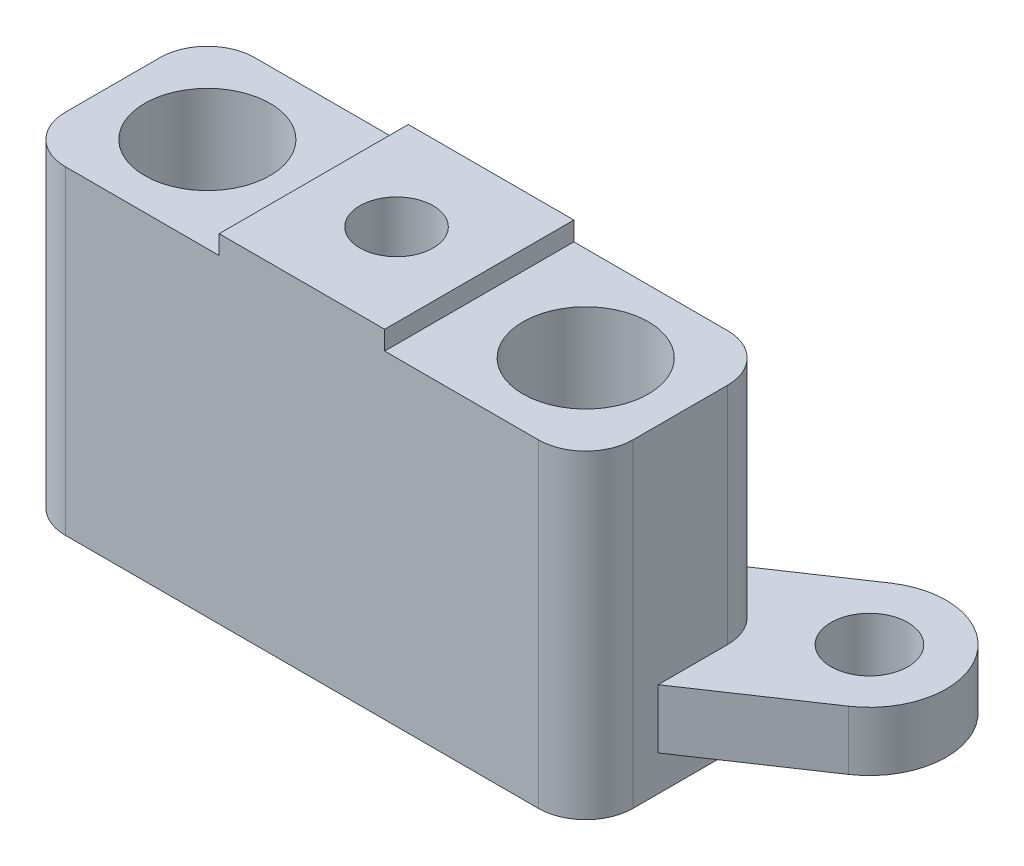
ISO-10303-21;
HEADER;
FILE_DESCRIPTION(('STEP AP214'),'2;1');
FILE_NAME('part.step','',(''),(''),'','','');
FILE_SCHEMA(('AUTOMOTIVE_DESIGN { 1 0 10303 214 1 1 1 1 }'));
ENDSEC;
DATA;
#1=APPLICATION_CONTEXT('core data for automotive mechanical design processes');
#2=APPLICATION_PROTOCOL_DEFINITION('international standard','automotive_design',2000,#1);
#3=PRODUCT_CONTEXT('',#1,'mechanical');
#4=PRODUCT('Part','Part','',(#3));
#5=PRODUCT_RELATED_PRODUCT_CATEGORY('part','',(#4));
#6=PRODUCT_DEFINITION_FORMATION('','',#4);
#7=PRODUCT_DEFINITION_CONTEXT('part definition',#1,'design');
#8=PRODUCT_DEFINITION('design','',#6,#7);
#9=PRODUCT_DEFINITION_SHAPE('','',#8);
#10=(LENGTH_UNIT() NAMED_UNIT(*) SI_UNIT(.MILLI.,.METRE.));
#11=(NAMED_UNIT(*) PLANE_ANGLE_UNIT() SI_UNIT($,.RADIAN.));
#12=(NAMED_UNIT(*) SI_UNIT($,.STERADIAN.) SOLID_ANGLE_UNIT());
#13=UNCERTAINTY_MEASURE_WITH_UNIT(LENGTH_MEASURE(1.E-05),#10,'distance_accuracy_value','');
#14=(GEOMETRIC_REPRESENTATION_CONTEXT(3) GLOBAL_UNCERTAINTY_ASSIGNED_CONTEXT((#13)) GLOBAL_UNIT_ASSIGNED_CONTEXT((#10,
#11,#12)) REPRESENTATION_CONTEXT('',''));
#15=CARTESIAN_POINT('',(0.,0.,0.));
#16=DIRECTION('',(0.,0.,1.));
#17=DIRECTION('',(1.,0.,0.));
#18=AXIS2_PLACEMENT_3D('',#15,#16,#17);
#19=CARTESIAN_POINT('',(0.,0.,0.));
#20=DIRECTION('',(0.,1.,0.));
#21=DIRECTION('',(0.,0.,1.));
#22=AXIS2_PLACEMENT_3D('',#19,#20,#21);
#23=PLANE('',#22);
#24=CARTESIAN_POINT('',(-15.,0.,-5.));
#25=DIRECTION('',(0.,-1.,0.));
#26=DIRECTION('',(0.,0.,-1.));
#27=AXIS2_PLACEMENT_3D('',#24,#25,#26);
#28=CIRCLE('',#27,1.625);
#29=CARTESIAN_POINT('',(-15.,0.,-6.625));
#30=VERTEX_POINT('',#29);
#31=EDGE_CURVE('E245',#30,#30,#28,.T.);
#32=ORIENTED_EDGE('',*,*,#31,.F.);
#33=EDGE_LOOP('',(#32));
#34=FACE_BOUND('',#33,.T.);
#35=DIRECTION('',(0.,0.,-1.));
#36=VECTOR('',#35,1.);
#37=CARTESIAN_POINT('',(-12.,0.,4.));
#38=LINE('',#37,#36);
#39=CARTESIAN_POINT('',(-12.,0.,0.934295685774307));
#40=VERTEX_POINT('',#39);
#41=CARTESIAN_POINT('',(-12.,0.,-2.));
#42=VERTEX_POINT('',#41);
#43=EDGE_CURVE('E346',#40,#42,#38,.T.);
#44=ORIENTED_EDGE('',*,*,#43,.F.);
#45=DIRECTION('',(-0.829790776174109,0.,-0.558074607715107));
#46=VECTOR('',#45,1.);
#47=CARTESIAN_POINT('',(-16.8137424750741,0.,-2.30317997743414));
#48=LINE('',#47,#46);
#49=CARTESIAN_POINT('',(-16.8137424750741,0.,-2.30317997743414));
#50=VERTEX_POINT('',#49);
#51=EDGE_CURVE('E260',#40,#50,#48,.T.);
#52=ORIENTED_EDGE('',*,*,#51,.T.);
#53=CARTESIAN_POINT('',(-15.,0.,-5.));
#54=DIRECTION('',(0.,-1.,0.));
#55=DIRECTION('',(0.,0.,-1.));
#56=AXIS2_PLACEMENT_3D('',#53,#54,#55);
#57=CIRCLE('',#56,3.25);
#58=CARTESIAN_POINT('',(-13.1862575249259,0.,-7.69682002256585));
#59=VERTEX_POINT('',#58);
#60=EDGE_CURVE('E253',#50,#59,#57,.T.);
#61=ORIENTED_EDGE('',*,*,#60,.T.);
#62=DIRECTION('',(0.829790776174108,0.,0.558074607715108));
#63=VECTOR('',#62,1.);
#64=CARTESIAN_POINT('',(-13.1862575249259,0.,-7.69682002256585));
#65=LINE('',#64,#63);
#66=CARTESIAN_POINT('',(-7.68952444749679,0.,-4.));
#67=VERTEX_POINT('',#66);
#68=EDGE_CURVE('E273',#59,#67,#65,.T.);
#69=ORIENTED_EDGE('',*,*,#68,.T.);
#70=DIRECTION('',(1.,0.,0.));
#71=VECTOR('',#70,1.);
#72=CARTESIAN_POINT('',(-12.,0.,-4.));
#73=LINE('',#72,#71);
#74=CARTESIAN_POINT('',(-10.,0.,-4.));
#75=VERTEX_POINT('',#74);
#76=EDGE_CURVE('E406',#75,#67,#73,.T.);
#77=ORIENTED_EDGE('',*,*,#76,.F.);
#78=CARTESIAN_POINT('',(-10.,0.,-2.));
#79=DIRECTION('',(0.,1.,0.));
#80=DIRECTION('',(0.,0.,1.));
#81=AXIS2_PLACEMENT_3D('',#78,#79,#80);
#82=CIRCLE('',#81,2.);
#83=EDGE_CURVE('E63',#75,#42,#82,.T.);
#84=ORIENTED_EDGE('',*,*,#83,.T.);
#85=EDGE_LOOP('',(#44,#52,#61,#69,#77,#84));
#86=FACE_BOUND('',#85,.T.);
#87=ADVANCED_FACE('F41',(#34,#86),#23,.F.);
#88=CARTESIAN_POINT('',(15.,0.,-5.));
#89=DIRECTION('',(0.,-1.,0.));
#90=DIRECTION('',(0.,0.,1.));
#91=AXIS2_PLACEMENT_3D('',#88,#89,#90);
#92=CIRCLE('',#91,1.625);
#93=CARTESIAN_POINT('',(15.,0.,-3.375));
#94=VERTEX_POINT('',#93);
#95=EDGE_CURVE('E233',#94,#94,#92,.T.);
#96=ORIENTED_EDGE('',*,*,#95,.F.);
#97=EDGE_LOOP('',(#96));
#98=FACE_BOUND('',#97,.T.);
#99=DIRECTION('',(0.,0.,1.));
#100=VECTOR('',#99,1.);
#101=CARTESIAN_POINT('',(12.,0.,4.));
#102=LINE('',#101,#100);
#103=CARTESIAN_POINT('',(12.,0.,-2.));
#104=VERTEX_POINT('',#103);
#105=CARTESIAN_POINT('',(12.,0.,0.934295685774307));
#106=VERTEX_POINT('',#105);
#107=EDGE_CURVE('E395',#104,#106,#102,.T.);
#108=ORIENTED_EDGE('',*,*,#107,.F.);
#109=CARTESIAN_POINT('',(9.99999999999999,0.,-2.));
#110=DIRECTION('',(0.,1.,0.));
#111=DIRECTION('',(0.,0.,1.));
#112=AXIS2_PLACEMENT_3D('',#109,#110,#111);
#113=CIRCLE('',#112,2.);
#114=CARTESIAN_POINT('',(9.99999999999999,0.,-4.));
#115=VERTEX_POINT('',#114);
#116=EDGE_CURVE('E390',#104,#115,#113,.T.);
#117=ORIENTED_EDGE('',*,*,#116,.T.);
#118=CARTESIAN_POINT('',(7.68952444749679,0.,-4.));
#119=VERTEX_POINT('',#118);
#120=EDGE_CURVE('E342',#119,#115,#73,.T.);
#121=ORIENTED_EDGE('',*,*,#120,.F.);
#122=DIRECTION('',(0.829790776174108,0.,-0.558074607715108));
#123=VECTOR('',#122,1.);
#124=CARTESIAN_POINT('',(13.1862575249259,0.,-7.69682002256585));
#125=LINE('',#124,#123);
#126=CARTESIAN_POINT('',(13.1862575249259,0.,-7.69682002256585));
#127=VERTEX_POINT('',#126);
#128=EDGE_CURVE('E228',#119,#127,#125,.T.);
#129=ORIENTED_EDGE('',*,*,#128,.T.);
#130=CARTESIAN_POINT('',(15.,0.,-5.));
#131=DIRECTION('',(0.,-1.,0.));
#132=DIRECTION('',(0.,0.,1.));
#133=AXIS2_PLACEMENT_3D('',#130,#131,#132);
#134=CIRCLE('',#133,3.25);
#135=CARTESIAN_POINT('',(16.8137424750741,0.,-2.30317997743414));
#136=VERTEX_POINT('',#135);
#137=EDGE_CURVE('E240',#127,#136,#134,.T.);
#138=ORIENTED_EDGE('',*,*,#137,.T.);
#139=DIRECTION('',(-0.829790776174109,0.,0.558074607715107));
#140=VECTOR('',#139,1.);
#141=CARTESIAN_POINT('',(16.8137424750741,0.,-2.30317997743414));
#142=LINE('',#141,#140);
#143=EDGE_CURVE('E208',#136,#106,#142,.T.);
#144=ORIENTED_EDGE('',*,*,#143,.T.);
#145=EDGE_LOOP('',(#108,#117,#121,#129,#138,#144));
#146=FACE_BOUND('',#145,.T.);
#147=ADVANCED_FACE('F394',(#98,#146),#23,.F.);
#148=CARTESIAN_POINT('',(3.5,12.8,-4.));
#149=DIRECTION('',(-1.,0.,0.));
#150=DIRECTION('',(0.,0.,1.));
#151=AXIS2_PLACEMENT_3D('',#148,#149,#150);
#152=PLANE('',#151);
#153=DIRECTION('',(0.,0.,1.));
#154=VECTOR('',#153,1.);
#155=CARTESIAN_POINT('',(3.5,12.,-4.));
#156=LINE('',#155,#154);
#157=CARTESIAN_POINT('',(3.5,12.,-4.));
#158=VERTEX_POINT('',#157);
#159=CARTESIAN_POINT('',(3.5,12.,4.));
#160=VERTEX_POINT('',#159);
#161=EDGE_CURVE('E319',#158,#160,#156,.T.);
#162=ORIENTED_EDGE('',*,*,#161,.F.);
#163=DIRECTION('',(0.,-1.,0.));
#164=VECTOR('',#163,1.);
#165=CARTESIAN_POINT('',(3.5,12.8,-4.));
#166=LINE('',#165,#164);
#167=CARTESIAN_POINT('',(3.5,12.8,-4.));
#168=VERTEX_POINT('',#167);
#169=EDGE_CURVE('E339',#168,#158,#166,.T.);
#170=ORIENTED_EDGE('',*,*,#169,.F.);
#171=DIRECTION('',(0.,0.,-1.));
#172=VECTOR('',#171,1.);
#173=CARTESIAN_POINT('',(3.5,12.8,-4.));
#174=LINE('',#173,#172);
#175=CARTESIAN_POINT('',(3.5,12.8,4.));
#176=VERTEX_POINT('',#175);
#177=EDGE_CURVE('E322',#176,#168,#174,.T.);
#178=ORIENTED_EDGE('',*,*,#177,.F.);
#179=DIRECTION('',(0.,-1.,0.));
#180=VECTOR('',#179,1.);
#181=CARTESIAN_POINT('',(3.5,12.8,4.));
#182=LINE('',#181,#180);
#183=EDGE_CURVE('E331',#176,#160,#182,.T.);
#184=ORIENTED_EDGE('',*,*,#183,.T.);
#185=EDGE_LOOP('',(#162,#170,#178,#184));
#186=FACE_BOUND('',#185,.T.);
#187=ADVANCED_FACE('F438',(#186),#152,.F.);
#188=CARTESIAN_POINT('',(-3.5,12.8,-4.));
#189=DIRECTION('',(1.,0.,0.));
#190=DIRECTION('',(0.,0.,-1.));
#191=AXIS2_PLACEMENT_3D('',#188,#189,#190);
#192=PLANE('',#191);
#193=DIRECTION('',(0.,0.,-1.));
#194=VECTOR('',#193,1.);
#195=CARTESIAN_POINT('',(-3.5,12.,-4.));
#196=LINE('',#195,#194);
#197=CARTESIAN_POINT('',(-3.5,12.,4.));
#198=VERTEX_POINT('',#197);
#199=CARTESIAN_POINT('',(-3.5,12.,-4.));
#200=VERTEX_POINT('',#199);
#201=EDGE_CURVE('E317',#198,#200,#196,.T.);
#202=ORIENTED_EDGE('',*,*,#201,.F.);
#203=DIRECTION('',(0.,-1.,0.));
#204=VECTOR('',#203,1.);
#205=CARTESIAN_POINT('',(-3.5,12.8,4.));
#206=LINE('',#205,#204);
#207=CARTESIAN_POINT('',(-3.5,12.8,4.));
#208=VERTEX_POINT('',#207);
#209=EDGE_CURVE('E333',#208,#198,#206,.T.);
#210=ORIENTED_EDGE('',*,*,#209,.F.);
#211=DIRECTION('',(0.,0.,1.));
#212=VECTOR('',#211,1.);
#213=CARTESIAN_POINT('',(-3.5,12.8,-4.));
#214=LINE('',#213,#212);
#215=CARTESIAN_POINT('',(-3.5,12.8,-4.));
#216=VERTEX_POINT('',#215);
#217=EDGE_CURVE('E327',#216,#208,#214,.T.);
#218=ORIENTED_EDGE('',*,*,#217,.F.);
#219=DIRECTION('',(0.,-1.,0.));
#220=VECTOR('',#219,1.);
#221=CARTESIAN_POINT('',(-3.5,12.8,-4.));
#222=LINE('',#221,#220);
#223=EDGE_CURVE('E336',#216,#200,#222,.T.);
#224=ORIENTED_EDGE('',*,*,#223,.T.);
#225=EDGE_LOOP('',(#202,#210,#218,#224));
#226=FACE_BOUND('',#225,.T.);
#227=ADVANCED_FACE('F445',(#226),#192,.F.);
#228=CARTESIAN_POINT('',(-3.5,12.8,-4.));
#229=DIRECTION('',(0.,0.,1.));
#230=DIRECTION('',(1.,0.,0.));
#231=AXIS2_PLACEMENT_3D('',#228,#229,#230);
#232=PLANE('',#231);
#233=DIRECTION('',(1.,0.,0.));
#234=VECTOR('',#233,1.);
#235=CARTESIAN_POINT('',(-12.,-1.5,-4.));
#236=LINE('',#235,#234);
#237=CARTESIAN_POINT('',(-10.,-1.5,-4.));
#238=VERTEX_POINT('',#237);
#239=CARTESIAN_POINT('',(9.99999999999999,-1.5,-4.));
#240=VERTEX_POINT('',#239);
#241=EDGE_CURVE('E415',#238,#240,#236,.T.);
#242=ORIENTED_EDGE('',*,*,#241,.F.);
#243=DIRECTION('',(0.,1.,0.));
#244=VECTOR('',#243,1.);
#245=CARTESIAN_POINT('',(-10.,12.8,-4.));
#246=LINE('',#245,#244);
#247=EDGE_CURVE('E387',#238,#75,#246,.T.);
#248=ORIENTED_EDGE('',*,*,#247,.T.);
#249=ORIENTED_EDGE('',*,*,#76,.T.);
#250=DIRECTION('',(0.,-1.,0.));
#251=VECTOR('',#250,1.);
#252=CARTESIAN_POINT('',(-7.68952444749679,2.5,-4.));
#253=LINE('',#252,#251);
#254=CARTESIAN_POINT('',(-7.68952444749679,2.5,-4.));
#255=VERTEX_POINT('',#254);
#256=EDGE_CURVE('E284',#255,#67,#253,.T.);
#257=ORIENTED_EDGE('',*,*,#256,.F.);
#258=DIRECTION('',(-1.,0.,0.));
#259=VECTOR('',#258,1.);
#260=CARTESIAN_POINT('',(-12.,2.5,-4.));
#261=LINE('',#260,#259);
#262=CARTESIAN_POINT('',(-10.,2.5,-4.));
#263=VERTEX_POINT('',#262);
#264=EDGE_CURVE('E263',#255,#263,#261,.T.);
#265=ORIENTED_EDGE('',*,*,#264,.T.);
#266=DIRECTION('',(0.,-1.,0.));
#267=VECTOR('',#266,1.);
#268=CARTESIAN_POINT('',(-10.,12.8,-4.));
#269=LINE('',#268,#267);
#270=CARTESIAN_POINT('',(-10.,12.,-4.));
#271=VERTEX_POINT('',#270);
#272=EDGE_CURVE('E383',#263,#271,#269,.F.);
#273=ORIENTED_EDGE('',*,*,#272,.T.);
#274=DIRECTION('',(-1.,0.,0.));
#275=VECTOR('',#274,1.);
#276=CARTESIAN_POINT('',(12.,12.,-4.));
#277=LINE('',#276,#275);
#278=EDGE_CURVE('E308',#200,#271,#277,.T.);
#279=ORIENTED_EDGE('',*,*,#278,.F.);
#280=ORIENTED_EDGE('',*,*,#223,.F.);
#281=DIRECTION('',(-1.,0.,0.));
#282=VECTOR('',#281,1.);
#283=CARTESIAN_POINT('',(-3.5,12.8,-4.));
#284=LINE('',#283,#282);
#285=EDGE_CURVE('E325',#168,#216,#284,.T.);
#286=ORIENTED_EDGE('',*,*,#285,.F.);
#287=ORIENTED_EDGE('',*,*,#169,.T.);
#288=CARTESIAN_POINT('',(9.99999999999999,12.,-4.));
#289=VERTEX_POINT('',#288);
#290=EDGE_CURVE('E309',#289,#158,#277,.T.);
#291=ORIENTED_EDGE('',*,*,#290,.F.);
#292=DIRECTION('',(0.,-1.,0.));
#293=VECTOR('',#292,1.);
#294=CARTESIAN_POINT('',(9.99999999999999,12.8,-4.));
#295=LINE('',#294,#293);
#296=CARTESIAN_POINT('',(9.99999999999999,2.5,-4.));
#297=VERTEX_POINT('',#296);
#298=EDGE_CURVE('E380',#289,#297,#295,.T.);
#299=ORIENTED_EDGE('',*,*,#298,.T.);
#300=DIRECTION('',(-1.,0.,0.));
#301=VECTOR('',#300,1.);
#302=CARTESIAN_POINT('',(12.,2.5,-4.));
#303=LINE('',#302,#301);
#304=CARTESIAN_POINT('',(7.68952444749679,2.5,-4.));
#305=VERTEX_POINT('',#304);
#306=EDGE_CURVE('E237',#297,#305,#303,.T.);
#307=ORIENTED_EDGE('',*,*,#306,.T.);
#308=DIRECTION('',(0.,-1.,0.));
#309=VECTOR('',#308,1.);
#310=CARTESIAN_POINT('',(7.68952444749679,2.5,-4.));
#311=LINE('',#310,#309);
#312=EDGE_CURVE('E246',#305,#119,#311,.T.);
#313=ORIENTED_EDGE('',*,*,#312,.T.);
#314=ORIENTED_EDGE('',*,*,#120,.T.);
#315=DIRECTION('',(0.,1.,0.));
#316=VECTOR('',#315,1.);
#317=CARTESIAN_POINT('',(9.99999999999999,12.8,-4.));
#318=LINE('',#317,#316);
#319=EDGE_CURVE('E385',#115,#240,#318,.F.);
#320=ORIENTED_EDGE('',*,*,#319,.T.);
#321=EDGE_LOOP('',(#242,#248,#249,#257,#265,#273,#279,#280,#286,#287,#291,#299,#307,#313,#314,#320));
#322=FACE_BOUND('',#321,.T.);
#323=ADVANCED_FACE('F401',(#322),#232,.F.);
#324=CARTESIAN_POINT('',(-3.5,12.8,4.));
#325=DIRECTION('',(0.,0.,-1.));
#326=DIRECTION('',(-1.,0.,0.));
#327=AXIS2_PLACEMENT_3D('',#324,#325,#326);
#328=PLANE('',#327);
#329=DIRECTION('',(1.,0.,0.));
#330=VECTOR('',#329,1.);
#331=CARTESIAN_POINT('',(12.,12.,4.));
#332=LINE('',#331,#330);
#333=CARTESIAN_POINT('',(-10.,12.,4.));
#334=VERTEX_POINT('',#333);
#335=EDGE_CURVE('E315',#334,#198,#332,.T.);
#336=ORIENTED_EDGE('',*,*,#335,.F.);
#337=DIRECTION('',(0.,-1.,0.));
#338=VECTOR('',#337,1.);
#339=CARTESIAN_POINT('',(-10.,12.8,4.));
#340=LINE('',#339,#338);
#341=CARTESIAN_POINT('',(-10.,-1.5,4.));
#342=VERTEX_POINT('',#341);
#343=EDGE_CURVE('E345',#334,#342,#340,.T.);
#344=ORIENTED_EDGE('',*,*,#343,.T.);
#345=DIRECTION('',(-1.,0.,0.));
#346=VECTOR('',#345,1.);
#347=CARTESIAN_POINT('',(-12.,-1.5,4.));
#348=LINE('',#347,#346);
#349=CARTESIAN_POINT('',(9.99999999999999,-1.5,4.));
#350=VERTEX_POINT('',#349);
#351=EDGE_CURVE('E420',#350,#342,#348,.T.);
#352=ORIENTED_EDGE('',*,*,#351,.F.);
#353=DIRECTION('',(0.,-1.,0.));
#354=VECTOR('',#353,1.);
#355=CARTESIAN_POINT('',(9.99999999999999,12.8,4.));
#356=LINE('',#355,#354);
#357=CARTESIAN_POINT('',(9.99999999999999,12.,4.));
#358=VERTEX_POINT('',#357);
#359=EDGE_CURVE('E343',#350,#358,#356,.F.);
#360=ORIENTED_EDGE('',*,*,#359,.T.);
#361=EDGE_CURVE('E314',#160,#358,#332,.T.);
#362=ORIENTED_EDGE('',*,*,#361,.F.);
#363=ORIENTED_EDGE('',*,*,#183,.F.);
#364=DIRECTION('',(1.,0.,0.));
#365=VECTOR('',#364,1.);
#366=CARTESIAN_POINT('',(-3.5,12.8,4.));
#367=LINE('',#366,#365);
#368=EDGE_CURVE('E329',#208,#176,#367,.T.);
#369=ORIENTED_EDGE('',*,*,#368,.F.);
#370=ORIENTED_EDGE('',*,*,#209,.T.);
#371=EDGE_LOOP('',(#336,#344,#352,#360,#362,#363,#369,#370));
#372=FACE_BOUND('',#371,.T.);
#373=ADVANCED_FACE('F453',(#372),#328,.F.);
#374=CARTESIAN_POINT('',(0.,12.8,0.));
#375=DIRECTION('',(0.,1.,0.));
#376=DIRECTION('',(0.,0.,1.));
#377=AXIS2_PLACEMENT_3D('',#374,#375,#376);
#378=PLANE('',#377);
#379=CARTESIAN_POINT('',(0.,12.8,0.));
#380=DIRECTION('',(0.,1.,0.));
#381=DIRECTION('',(0.,0.,1.));
#382=AXIS2_PLACEMENT_3D('',#379,#380,#381);
#383=CIRCLE('',#382,1.55);
#384=CARTESIAN_POINT('',(0.,12.8,1.55));
#385=VERTEX_POINT('',#384);
#386=EDGE_CURVE('E280',#385,#385,#383,.T.);
#387=ORIENTED_EDGE('',*,*,#386,.F.);
#388=EDGE_LOOP('',(#387));
#389=FACE_BOUND('',#388,.T.);
#390=ORIENTED_EDGE('',*,*,#177,.T.);
#391=ORIENTED_EDGE('',*,*,#285,.T.);
#392=ORIENTED_EDGE('',*,*,#217,.T.);
#393=ORIENTED_EDGE('',*,*,#368,.T.);
#394=EDGE_LOOP('',(#390,#391,#392,#393));
#395=FACE_BOUND('',#394,.T.);
#396=ADVANCED_FACE('F451',(#389,#395),#378,.T.);
#397=CARTESIAN_POINT('',(-8.00000000000001,12.,0.));
#398=DIRECTION('',(0.,-1.,0.));
#399=DIRECTION('',(0.,0.,-1.));
#400=AXIS2_PLACEMENT_3D('',#397,#398,#399);
#401=CYLINDRICAL_SURFACE('',#400,2.65);
#402=CARTESIAN_POINT('',(-8.00000000000001,12.,0.));
#403=DIRECTION('',(0.,1.,0.));
#404=DIRECTION('',(0.,0.,1.));
#405=AXIS2_PLACEMENT_3D('',#402,#403,#404);
#406=CIRCLE('',#405,2.65);
#407=CARTESIAN_POINT('',(-8.00000000000001,12.,2.65));
#408=VERTEX_POINT('',#407);
#409=EDGE_CURVE('E294',#408,#408,#406,.T.);
#410=ORIENTED_EDGE('',*,*,#409,.T.);
#411=EDGE_LOOP('',(#410));
#412=FACE_BOUND('',#411,.T.);
#413=CARTESIAN_POINT('',(-8.00000000000001,0.,0.));
#414=DIRECTION('',(0.,1.,0.));
#415=DIRECTION('',(0.,0.,1.));
#416=AXIS2_PLACEMENT_3D('',#413,#414,#415);
#417=CIRCLE('',#416,2.65);
#418=CARTESIAN_POINT('',(-8.00000000000001,0.,2.65));
#419=VERTEX_POINT('',#418);
#420=EDGE_CURVE('E291',#419,#419,#417,.T.);
#421=ORIENTED_EDGE('',*,*,#420,.F.);
#422=EDGE_LOOP('',(#421));
#423=FACE_BOUND('',#422,.T.);
#424=ADVANCED_FACE('F537',(#412,#423),#401,.F.);
#425=CARTESIAN_POINT('',(-12.,12.,-4.));
#426=DIRECTION('',(1.,0.,0.));
#427=DIRECTION('',(0.,0.,-1.));
#428=AXIS2_PLACEMENT_3D('',#425,#426,#427);
#429=PLANE('',#428);
#430=DIRECTION('',(0.,0.,-1.));
#431=VECTOR('',#430,1.);
#432=CARTESIAN_POINT('',(-12.,-1.5,4.));
#433=LINE('',#432,#431);
#434=CARTESIAN_POINT('',(-12.,-1.5,2.));
#435=VERTEX_POINT('',#434);
#436=CARTESIAN_POINT('',(-12.,-1.5,-2.));
#437=VERTEX_POINT('',#436);
#438=EDGE_CURVE('E423',#435,#437,#433,.T.);
#439=ORIENTED_EDGE('',*,*,#438,.F.);
#440=DIRECTION('',(0.,-1.,0.));
#441=VECTOR('',#440,1.);
#442=CARTESIAN_POINT('',(-12.,12.,2.));
#443=LINE('',#442,#441);
#444=CARTESIAN_POINT('',(-12.,12.,2.));
#445=VERTEX_POINT('',#444);
#446=EDGE_CURVE('E362',#435,#445,#443,.F.);
#447=ORIENTED_EDGE('',*,*,#446,.T.);
#448=DIRECTION('',(0.,0.,1.));
#449=VECTOR('',#448,1.);
#450=CARTESIAN_POINT('',(-12.,12.,-4.));
#451=LINE('',#450,#449);
#452=CARTESIAN_POINT('',(-12.,12.,-2.));
#453=VERTEX_POINT('',#452);
#454=EDGE_CURVE('E311',#453,#445,#451,.T.);
#455=ORIENTED_EDGE('',*,*,#454,.F.);
#456=DIRECTION('',(0.,-1.,0.));
#457=VECTOR('',#456,1.);
#458=CARTESIAN_POINT('',(-12.,12.,-2.));
#459=LINE('',#458,#457);
#460=CARTESIAN_POINT('',(-12.,2.5,-2.));
#461=VERTEX_POINT('',#460);
#462=EDGE_CURVE('E357',#453,#461,#459,.T.);
#463=ORIENTED_EDGE('',*,*,#462,.T.);
#464=DIRECTION('',(0.,0.,1.));
#465=VECTOR('',#464,1.);
#466=CARTESIAN_POINT('',(-12.,2.5,0.934295685774307));
#467=LINE('',#466,#465);
#468=CARTESIAN_POINT('',(-12.,2.5,0.934295685774307));
#469=VERTEX_POINT('',#468);
#470=EDGE_CURVE('E265',#461,#469,#467,.T.);
#471=ORIENTED_EDGE('',*,*,#470,.T.);
#472=DIRECTION('',(0.,-1.,0.));
#473=VECTOR('',#472,1.);
#474=CARTESIAN_POINT('',(-12.,2.5,0.934295685774307));
#475=LINE('',#474,#473);
#476=EDGE_CURVE('E281',#469,#40,#475,.T.);
#477=ORIENTED_EDGE('',*,*,#476,.T.);
#478=ORIENTED_EDGE('',*,*,#43,.T.);
#479=DIRECTION('',(0.,1.,0.));
#480=VECTOR('',#479,1.);
#481=CARTESIAN_POINT('',(-12.,12.,-2.));
#482=LINE('',#481,#480);
#483=EDGE_CURVE('E360',#42,#437,#482,.F.);
#484=ORIENTED_EDGE('',*,*,#483,.T.);
#485=EDGE_LOOP('',(#439,#447,#455,#463,#471,#477,#478,#484));
#486=FACE_BOUND('',#485,.T.);
#487=ADVANCED_FACE('F492',(#486),#429,.F.);
#488=CARTESIAN_POINT('',(0.,12.,0.));
#489=DIRECTION('',(0.,-1.,0.));
#490=DIRECTION('',(0.,0.,-1.));
#491=AXIS2_PLACEMENT_3D('',#488,#489,#490);
#492=PLANE('',#491);
#493=ORIENTED_EDGE('',*,*,#409,.F.);
#494=EDGE_LOOP('',(#493));
#495=FACE_BOUND('',#494,.T.);
#496=ORIENTED_EDGE('',*,*,#454,.T.);
#497=CARTESIAN_POINT('',(-10.,12.,2.));
#498=DIRECTION('',(0.,-1.,0.));
#499=DIRECTION('',(0.,0.,-1.));
#500=AXIS2_PLACEMENT_3D('',#497,#498,#499);
#501=CIRCLE('',#500,2.);
#502=EDGE_CURVE('E366',#445,#334,#501,.F.);
#503=ORIENTED_EDGE('',*,*,#502,.T.);
#504=ORIENTED_EDGE('',*,*,#335,.T.);
#505=ORIENTED_EDGE('',*,*,#201,.T.);
#506=ORIENTED_EDGE('',*,*,#278,.T.);
#507=CARTESIAN_POINT('',(-10.,12.,-2.));
#508=DIRECTION('',(0.,-1.,0.));
#509=DIRECTION('',(0.,0.,-1.));
#510=AXIS2_PLACEMENT_3D('',#507,#508,#509);
#511=CIRCLE('',#510,2.);
#512=EDGE_CURVE('E364',#271,#453,#511,.F.);
#513=ORIENTED_EDGE('',*,*,#512,.T.);
#514=EDGE_LOOP('',(#496,#503,#504,#505,#506,#513));
#515=FACE_BOUND('',#514,.T.);
#516=ADVANCED_FACE('F487',(#495,#515),#492,.F.);
#517=CARTESIAN_POINT('',(7.99999999999999,12.,0.));
#518=DIRECTION('',(0.,1.,0.));
#519=DIRECTION('',(0.,0.,1.));
#520=AXIS2_PLACEMENT_3D('',#517,#518,#519);
#521=CIRCLE('',#520,2.65);
#522=CARTESIAN_POINT('',(7.99999999999999,12.,2.65));
#523=VERTEX_POINT('',#522);
#524=EDGE_CURVE('E300',#523,#523,#521,.T.);
#525=ORIENTED_EDGE('',*,*,#524,.F.);
#526=EDGE_LOOP('',(#525));
#527=FACE_BOUND('',#526,.T.);
#528=ORIENTED_EDGE('',*,*,#361,.T.);
#529=CARTESIAN_POINT('',(9.99999999999999,12.,2.));
#530=DIRECTION('',(0.,-1.,0.));
#531=DIRECTION('',(0.,0.,-1.));
#532=AXIS2_PLACEMENT_3D('',#529,#530,#531);
#533=CIRCLE('',#532,2.);
#534=CARTESIAN_POINT('',(12.,12.,2.));
#535=VERTEX_POINT('',#534);
#536=EDGE_CURVE('E378',#358,#535,#533,.F.);
#537=ORIENTED_EDGE('',*,*,#536,.T.);
#538=DIRECTION('',(0.,0.,-1.));
#539=VECTOR('',#538,1.);
#540=CARTESIAN_POINT('',(12.,12.,-4.));
#541=LINE('',#540,#539);
#542=CARTESIAN_POINT('',(12.,12.,-2.));
#543=VERTEX_POINT('',#542);
#544=EDGE_CURVE('E303',#535,#543,#541,.T.);
#545=ORIENTED_EDGE('',*,*,#544,.T.);
#546=CARTESIAN_POINT('',(9.99999999999999,12.,-2.));
#547=DIRECTION('',(0.,-1.,0.));
#548=DIRECTION('',(0.,0.,-1.));
#549=AXIS2_PLACEMENT_3D('',#546,#547,#548);
#550=CIRCLE('',#549,2.);
#551=EDGE_CURVE('E376',#543,#289,#550,.F.);
#552=ORIENTED_EDGE('',*,*,#551,.T.);
#553=ORIENTED_EDGE('',*,*,#290,.T.);
#554=ORIENTED_EDGE('',*,*,#161,.T.);
#555=EDGE_LOOP('',(#528,#537,#545,#552,#553,#554));
#556=FACE_BOUND('',#555,.T.);
#557=ADVANCED_FACE('F526',(#527,#556),#492,.F.);
#558=CARTESIAN_POINT('',(12.,12.,-4.));
#559=DIRECTION('',(-1.,0.,0.));
#560=DIRECTION('',(0.,0.,1.));
#561=AXIS2_PLACEMENT_3D('',#558,#559,#560);
#562=PLANE('',#561);
#563=ORIENTED_EDGE('',*,*,#544,.F.);
#564=DIRECTION('',(0.,-1.,0.));
#565=VECTOR('',#564,1.);
#566=CARTESIAN_POINT('',(12.,12.,2.));
#567=LINE('',#566,#565);
#568=CARTESIAN_POINT('',(12.,-1.5,2.));
#569=VERTEX_POINT('',#568);
#570=EDGE_CURVE('E373',#535,#569,#567,.T.);
#571=ORIENTED_EDGE('',*,*,#570,.T.);
#572=DIRECTION('',(0.,0.,1.));
#573=VECTOR('',#572,1.);
#574=CARTESIAN_POINT('',(12.,-1.5,4.));
#575=LINE('',#574,#573);
#576=CARTESIAN_POINT('',(12.,-1.5,-2.));
#577=VERTEX_POINT('',#576);
#578=EDGE_CURVE('E414',#577,#569,#575,.T.);
#579=ORIENTED_EDGE('',*,*,#578,.F.);
#580=DIRECTION('',(0.,1.,0.));
#581=VECTOR('',#580,1.);
#582=CARTESIAN_POINT('',(12.,12.,-2.));
#583=LINE('',#582,#581);
#584=EDGE_CURVE('E370',#577,#104,#583,.T.);
#585=ORIENTED_EDGE('',*,*,#584,.T.);
#586=ORIENTED_EDGE('',*,*,#107,.T.);
#587=DIRECTION('',(0.,-1.,0.));
#588=VECTOR('',#587,1.);
#589=CARTESIAN_POINT('',(12.,2.5,0.934295685774307));
#590=LINE('',#589,#588);
#591=CARTESIAN_POINT('',(12.,2.5,0.934295685774307));
#592=VERTEX_POINT('',#591);
#593=EDGE_CURVE('E213',#592,#106,#590,.T.);
#594=ORIENTED_EDGE('',*,*,#593,.F.);
#595=DIRECTION('',(0.,0.,-1.));
#596=VECTOR('',#595,1.);
#597=CARTESIAN_POINT('',(12.,2.5,0.934295685774307));
#598=LINE('',#597,#596);
#599=CARTESIAN_POINT('',(12.,2.5,-2.));
#600=VERTEX_POINT('',#599);
#601=EDGE_CURVE('E224',#592,#600,#598,.T.);
#602=ORIENTED_EDGE('',*,*,#601,.T.);
#603=DIRECTION('',(0.,-1.,0.));
#604=VECTOR('',#603,1.);
#605=CARTESIAN_POINT('',(12.,12.,-2.));
#606=LINE('',#605,#604);
#607=EDGE_CURVE('E368',#600,#543,#606,.F.);
#608=ORIENTED_EDGE('',*,*,#607,.T.);
#609=EDGE_LOOP('',(#563,#571,#579,#585,#586,#594,#602,#608));
#610=FACE_BOUND('',#609,.T.);
#611=ADVANCED_FACE('F418',(#610),#562,.F.);
#612=CARTESIAN_POINT('',(7.99999999999999,12.,0.));
#613=DIRECTION('',(0.,-1.,0.));
#614=DIRECTION('',(0.,0.,-1.));
#615=AXIS2_PLACEMENT_3D('',#612,#613,#614);
#616=CYLINDRICAL_SURFACE('',#615,2.65);
#617=ORIENTED_EDGE('',*,*,#524,.T.);
#618=EDGE_LOOP('',(#617));
#619=FACE_BOUND('',#618,.T.);
#620=CARTESIAN_POINT('',(7.99999999999999,0.,0.));
#621=DIRECTION('',(0.,1.,0.));
#622=DIRECTION('',(0.,0.,1.));
#623=AXIS2_PLACEMENT_3D('',#620,#621,#622);
#624=CIRCLE('',#623,2.65);
#625=CARTESIAN_POINT('',(7.99999999999999,0.,2.65));
#626=VERTEX_POINT('',#625);
#627=EDGE_CURVE('E297',#626,#626,#624,.T.);
#628=ORIENTED_EDGE('',*,*,#627,.F.);
#629=EDGE_LOOP('',(#628));
#630=FACE_BOUND('',#629,.T.);
#631=ADVANCED_FACE('F550',(#619,#630),#616,.F.);
#632=CARTESIAN_POINT('',(0.,6.3,0.));
#633=DIRECTION('',(0.,1.,0.));
#634=DIRECTION('',(0.,0.,1.));
#635=AXIS2_PLACEMENT_3D('',#632,#633,#634);
#636=CYLINDRICAL_SURFACE('',#635,1.55);
#637=CARTESIAN_POINT('',(0.,6.3,0.));
#638=DIRECTION('',(0.,1.,0.));
#639=DIRECTION('',(0.,0.,1.));
#640=AXIS2_PLACEMENT_3D('',#637,#638,#639);
#641=CIRCLE('',#640,1.55);
#642=CARTESIAN_POINT('',(0.,6.3,1.55));
#643=VERTEX_POINT('',#642);
#644=EDGE_CURVE('E288',#643,#643,#641,.T.);
#645=CARTESIAN_POINT('',(0.,6.3,1.55));
#646=CARTESIAN_POINT('',(0.,6.36770833333333,1.55));
#647=CARTESIAN_POINT('',(0.,6.43541666666667,1.55));
#648=CARTESIAN_POINT('',(0.,6.57083333333333,1.55));
#649=CARTESIAN_POINT('',(0.,6.63854166666667,1.55));
#650=CARTESIAN_POINT('',(0.,6.77395833333333,1.55));
#651=CARTESIAN_POINT('',(0.,6.84166666666667,1.55));
#652=CARTESIAN_POINT('',(0.,6.97708333333333,1.55));
#653=CARTESIAN_POINT('',(0.,7.04479166666667,1.55));
#654=CARTESIAN_POINT('',(0.,7.18020833333333,1.55));
#655=CARTESIAN_POINT('',(0.,7.24791666666667,1.55));
#656=CARTESIAN_POINT('',(0.,7.38333333333333,1.55));
#657=CARTESIAN_POINT('',(0.,7.45104166666667,1.55));
#658=CARTESIAN_POINT('',(0.,7.58645833333333,1.55));
#659=CARTESIAN_POINT('',(0.,7.65416666666667,1.55));
#660=CARTESIAN_POINT('',(0.,7.78958333333333,1.55));
#661=CARTESIAN_POINT('',(0.,7.85729166666667,1.55));
#662=CARTESIAN_POINT('',(0.,7.99270833333333,1.55));
#663=CARTESIAN_POINT('',(0.,8.06041666666667,1.55));
#664=CARTESIAN_POINT('',(0.,8.19583333333333,1.55));
#665=CARTESIAN_POINT('',(0.,8.26354166666667,1.55));
#666=CARTESIAN_POINT('',(0.,8.39895833333333,1.55));
#667=CARTESIAN_POINT('',(0.,8.46666666666667,1.55));
#668=CARTESIAN_POINT('',(0.,8.60208333333333,1.55));
#669=CARTESIAN_POINT('',(0.,8.66979166666667,1.55));
#670=CARTESIAN_POINT('',(0.,8.80520833333333,1.55));
#671=CARTESIAN_POINT('',(0.,8.87291666666667,1.55));
#672=CARTESIAN_POINT('',(0.,9.00833333333333,1.55));
#673=CARTESIAN_POINT('',(0.,9.07604166666667,1.55));
#674=CARTESIAN_POINT('',(0.,9.21145833333333,1.55));
#675=CARTESIAN_POINT('',(0.,9.27916666666667,1.55));
#676=CARTESIAN_POINT('',(0.,9.41458333333333,1.55));
#677=CARTESIAN_POINT('',(0.,9.48229166666667,1.55));
#678=CARTESIAN_POINT('',(0.,9.61770833333333,1.55));
#679=CARTESIAN_POINT('',(0.,9.68541666666667,1.55));
#680=CARTESIAN_POINT('',(0.,9.82083333333333,1.55));
#681=CARTESIAN_POINT('',(0.,9.88854166666667,1.55));
#682=CARTESIAN_POINT('',(0.,10.0239583333333,1.55));
#683=CARTESIAN_POINT('',(0.,10.0916666666667,1.55));
#684=CARTESIAN_POINT('',(0.,10.2270833333333,1.55));
#685=CARTESIAN_POINT('',(0.,10.2947916666667,1.55));
#686=CARTESIAN_POINT('',(0.,10.4302083333333,1.55));
#687=CARTESIAN_POINT('',(0.,10.4979166666667,1.55));
#688=CARTESIAN_POINT('',(0.,10.6333333333333,1.55));
#689=CARTESIAN_POINT('',(0.,10.7010416666667,1.55));
#690=CARTESIAN_POINT('',(0.,10.8364583333333,1.55));
#691=CARTESIAN_POINT('',(0.,10.9041666666667,1.55));
#692=CARTESIAN_POINT('',(0.,11.0395833333333,1.55));
#693=CARTESIAN_POINT('',(0.,11.1072916666667,1.55));
#694=CARTESIAN_POINT('',(0.,11.2427083333333,1.55));
#695=CARTESIAN_POINT('',(0.,11.3104166666667,1.55));
#696=CARTESIAN_POINT('',(0.,11.4458333333333,1.55));
#697=CARTESIAN_POINT('',(0.,11.5135416666667,1.55));
#698=CARTESIAN_POINT('',(0.,11.6489583333333,1.55));
#699=CARTESIAN_POINT('',(0.,11.7166666666667,1.55));
#700=CARTESIAN_POINT('',(0.,11.8520833333333,1.55));
#701=CARTESIAN_POINT('',(0.,11.9197916666667,1.55));
#702=CARTESIAN_POINT('',(0.,12.0552083333333,1.55));
#703=CARTESIAN_POINT('',(0.,12.1229166666667,1.55));
#704=CARTESIAN_POINT('',(0.,12.2583333333333,1.55));
#705=CARTESIAN_POINT('',(0.,12.3260416666667,1.55));
#706=CARTESIAN_POINT('',(0.,12.4614583333333,1.55));
#707=CARTESIAN_POINT('',(0.,12.5291666666667,1.55));
#708=CARTESIAN_POINT('',(0.,12.6645833333333,1.55));
#709=CARTESIAN_POINT('',(0.,12.7322916666667,1.55));
#710=CARTESIAN_POINT('',(0.,12.8,1.55));
#711=B_SPLINE_CURVE_WITH_KNOTS('',3,(#645,#646,#647,#648,#649,#650,#651,#652,#653,#654,#655,
#656,#657,#658,#659,#660,#661,#662,#663,#664,#665,#666,#667,#668,#669,#670,#671,#672,#673,#674,
#675,#676,#677,#678,#679,#680,#681,#682,#683,#684,#685,#686,#687,#688,#689,#690,#691,#692,#693,
#694,#695,#696,#697,#698,#699,#700,#701,#702,#703,#704,#705,#706,#707,#708,#709,#710),
.UNSPECIFIED.,.F.,.F.,(4,2,2,2,2,2,2,2,2,2,2,2,2,2,2,2,2,2,2,2,2,2,2,2,2,2,2,2,2,2,2,2,4),(0.,
0.203125,0.40625,0.609375000000001,0.812500000000001,1.015625,1.21875,1.421875,1.625,1.828125,
2.03125,2.234375,2.4375,2.640625,2.84375,3.046875,3.25,3.453125,3.65625,3.859375,4.0625,
4.265625,4.46875,4.671875,4.875,5.078125,5.28125,5.484375,5.6875,5.890625,6.09375,6.296875,6.5),.UNSPECIFIED.);
#712=EDGE_CURVE('BSEAM548',#643,#385,#711,.T.);
#713=ORIENTED_EDGE('',*,*,#644,.F.);
#714=ORIENTED_EDGE('',*,*,#386,.T.);
#715=ORIENTED_EDGE('',*,*,#712,.T.);
#716=ORIENTED_EDGE('',*,*,#712,.F.);
#717=EDGE_LOOP('',(#713,#715,#714,#716));
#718=FACE_BOUND('',#717,.T.);
#719=ADVANCED_FACE('F548',(#718),#636,.F.);
#720=CARTESIAN_POINT('',(0.,6.3,0.));
#721=DIRECTION('',(0.,1.,0.));
#722=DIRECTION('',(0.,0.,1.));
#723=AXIS2_PLACEMENT_3D('',#720,#721,#722);
#724=PLANE('',#723);
#725=ORIENTED_EDGE('',*,*,#644,.T.);
#726=EDGE_LOOP('',(#725));
#727=FACE_BOUND('',#726,.T.);
#728=ADVANCED_FACE('F549',(#727),#724,.T.);
#729=CARTESIAN_POINT('',(-15.,2.5,-5.));
#730=DIRECTION('',(0.,-1.,0.));
#731=DIRECTION('',(0.,0.,-1.));
#732=AXIS2_PLACEMENT_3D('',#729,#730,#731);
#733=CYLINDRICAL_SURFACE('',#732,3.25);
#734=ORIENTED_EDGE('',*,*,#60,.F.);
#735=DIRECTION('',(0.,-1.,0.));
#736=VECTOR('',#735,1.);
#737=CARTESIAN_POINT('',(-16.8137424750741,2.5,-2.30317997743414));
#738=LINE('',#737,#736);
#739=CARTESIAN_POINT('',(-16.8137424750741,2.5,-2.30317997743414));
#740=VERTEX_POINT('',#739);
#741=EDGE_CURVE('E278',#740,#50,#738,.T.);
#742=ORIENTED_EDGE('',*,*,#741,.F.);
#743=CARTESIAN_POINT('',(-15.,2.5,-5.));
#744=DIRECTION('',(0.,-1.,0.));
#745=DIRECTION('',(0.,0.,-1.));
#746=AXIS2_PLACEMENT_3D('',#743,#744,#745);
#747=CIRCLE('',#746,3.25);
#748=CARTESIAN_POINT('',(-13.1862575249259,2.5,-7.69682002256585));
#749=VERTEX_POINT('',#748);
#750=EDGE_CURVE('E256',#740,#749,#747,.T.);
#751=ORIENTED_EDGE('',*,*,#750,.T.);
#752=DIRECTION('',(0.,-1.,0.));
#753=VECTOR('',#752,1.);
#754=CARTESIAN_POINT('',(-13.1862575249259,2.5,-7.69682002256585));
#755=LINE('',#754,#753);
#756=EDGE_CURVE('E270',#749,#59,#755,.T.);
#757=ORIENTED_EDGE('',*,*,#756,.T.);
#758=EDGE_LOOP('',(#734,#742,#751,#757));
#759=FACE_BOUND('',#758,.T.);
#760=ADVANCED_FACE('F512',(#759),#733,.T.);
#761=CARTESIAN_POINT('',(-16.8137424750741,2.5,-2.30317997743414));
#762=DIRECTION('',(-0.558074607715107,0.,0.829790776174109));
#763=DIRECTION('',(0.829790776174109,0.,0.558074607715107));
#764=AXIS2_PLACEMENT_3D('',#761,#762,#763);
#765=PLANE('',#764);
#766=ORIENTED_EDGE('',*,*,#51,.F.);
#767=ORIENTED_EDGE('',*,*,#476,.F.);
#768=DIRECTION('',(-0.829790776174109,0.,-0.558074607715107));
#769=VECTOR('',#768,1.);
#770=CARTESIAN_POINT('',(-16.8137424750741,2.5,-2.30317997743414));
#771=LINE('',#770,#769);
#772=EDGE_CURVE('E267',#469,#740,#771,.T.);
#773=ORIENTED_EDGE('',*,*,#772,.T.);
#774=ORIENTED_EDGE('',*,*,#741,.T.);
#775=EDGE_LOOP('',(#766,#767,#773,#774));
#776=FACE_BOUND('',#775,.T.);
#777=ADVANCED_FACE('F517',(#776),#765,.T.);
#778=CARTESIAN_POINT('',(-13.1862575249259,2.5,-7.69682002256585));
#779=DIRECTION('',(0.558074607715108,0.,-0.829790776174108));
#780=DIRECTION('',(-0.829790776174108,0.,-0.558074607715108));
#781=AXIS2_PLACEMENT_3D('',#778,#779,#780);
#782=PLANE('',#781);
#783=ORIENTED_EDGE('',*,*,#68,.F.);
#784=ORIENTED_EDGE('',*,*,#756,.F.);
#785=DIRECTION('',(0.829790776174108,0.,0.558074607715108));
#786=VECTOR('',#785,1.);
#787=CARTESIAN_POINT('',(-13.1862575249259,2.5,-7.69682002256585));
#788=LINE('',#787,#786);
#789=EDGE_CURVE('E259',#749,#255,#788,.T.);
#790=ORIENTED_EDGE('',*,*,#789,.T.);
#791=ORIENTED_EDGE('',*,*,#256,.T.);
#792=EDGE_LOOP('',(#783,#784,#790,#791));
#793=FACE_BOUND('',#792,.T.);
#794=ADVANCED_FACE('F509',(#793),#782,.T.);
#795=CARTESIAN_POINT('',(-15.,2.5,-5.));
#796=DIRECTION('',(0.,-1.,0.));
#797=DIRECTION('',(0.,0.,-1.));
#798=AXIS2_PLACEMENT_3D('',#795,#796,#797);
#799=PLANE('',#798);
#800=CARTESIAN_POINT('',(-15.,2.5,-5.));
#801=DIRECTION('',(0.,-1.,0.));
#802=DIRECTION('',(0.,0.,-1.));
#803=AXIS2_PLACEMENT_3D('',#800,#801,#802);
#804=CIRCLE('',#803,1.625);
#805=CARTESIAN_POINT('',(-15.,2.5,-6.625));
#806=VERTEX_POINT('',#805);
#807=EDGE_CURVE('E250',#806,#806,#804,.T.);
#808=ORIENTED_EDGE('',*,*,#807,.T.);
#809=EDGE_LOOP('',(#808));
#810=FACE_BOUND('',#809,.T.);
#811=ORIENTED_EDGE('',*,*,#750,.F.);
#812=ORIENTED_EDGE('',*,*,#772,.F.);
#813=ORIENTED_EDGE('',*,*,#470,.F.);
#814=CARTESIAN_POINT('',(-10.,2.5,-2.));
#815=DIRECTION('',(0.,-1.,0.));
#816=DIRECTION('',(0.,0.,-1.));
#817=AXIS2_PLACEMENT_3D('',#814,#815,#816);
#818=CIRCLE('',#817,2.);
#819=EDGE_CURVE('E49',#461,#263,#818,.T.);
#820=ORIENTED_EDGE('',*,*,#819,.T.);
#821=ORIENTED_EDGE('',*,*,#264,.F.);
#822=ORIENTED_EDGE('',*,*,#789,.F.);
#823=EDGE_LOOP('',(#811,#812,#813,#820,#821,#822));
#824=FACE_BOUND('',#823,.T.);
#825=ADVANCED_FACE('F506',(#810,#824),#799,.F.);
#826=CARTESIAN_POINT('',(-15.,2.5,-5.));
#827=DIRECTION('',(0.,-1.,0.));
#828=DIRECTION('',(0.,0.,-1.));
#829=AXIS2_PLACEMENT_3D('',#826,#827,#828);
#830=CYLINDRICAL_SURFACE('',#829,1.625);
#831=ORIENTED_EDGE('',*,*,#807,.F.);
#832=EDGE_LOOP('',(#831));
#833=FACE_BOUND('',#832,.T.);
#834=ORIENTED_EDGE('',*,*,#31,.T.);
#835=EDGE_LOOP('',(#834));
#836=FACE_BOUND('',#835,.T.);
#837=ADVANCED_FACE('F582',(#833,#836),#830,.F.);
#838=CARTESIAN_POINT('',(15.,2.5,-5.));
#839=DIRECTION('',(0.,-1.,0.));
#840=DIRECTION('',(0.,0.,-1.));
#841=AXIS2_PLACEMENT_3D('',#838,#839,#840);
#842=CYLINDRICAL_SURFACE('',#841,3.25);
#843=ORIENTED_EDGE('',*,*,#137,.F.);
#844=DIRECTION('',(0.,-1.,0.));
#845=VECTOR('',#844,1.);
#846=CARTESIAN_POINT('',(13.1862575249259,2.5,-7.69682002256585));
#847=LINE('',#846,#845);
#848=CARTESIAN_POINT('',(13.1862575249259,2.5,-7.69682002256585));
#849=VERTEX_POINT('',#848);
#850=EDGE_CURVE('E227',#849,#127,#847,.T.);
#851=ORIENTED_EDGE('',*,*,#850,.F.);
#852=CARTESIAN_POINT('',(15.,2.5,-5.));
#853=DIRECTION('',(0.,-1.,0.));
#854=DIRECTION('',(0.,0.,1.));
#855=AXIS2_PLACEMENT_3D('',#852,#853,#854);
#856=CIRCLE('',#855,3.25);
#857=CARTESIAN_POINT('',(16.8137424750741,2.5,-2.30317997743414));
#858=VERTEX_POINT('',#857);
#859=EDGE_CURVE('E221',#849,#858,#856,.T.);
#860=ORIENTED_EDGE('',*,*,#859,.T.);
#861=DIRECTION('',(0.,-1.,0.));
#862=VECTOR('',#861,1.);
#863=CARTESIAN_POINT('',(16.8137424750741,2.5,-2.30317997743414));
#864=LINE('',#863,#862);
#865=EDGE_CURVE('E202',#858,#136,#864,.T.);
#866=ORIENTED_EDGE('',*,*,#865,.T.);
#867=EDGE_LOOP('',(#843,#851,#860,#866));
#868=FACE_BOUND('',#867,.T.);
#869=ADVANCED_FACE('F226',(#868),#842,.T.);
#870=CARTESIAN_POINT('',(13.1862575249259,2.5,-7.69682002256585));
#871=DIRECTION('',(-0.558074607715108,0.,-0.829790776174108));
#872=DIRECTION('',(-0.829790776174108,0.,0.558074607715108));
#873=AXIS2_PLACEMENT_3D('',#870,#871,#872);
#874=PLANE('',#873);
#875=ORIENTED_EDGE('',*,*,#128,.F.);
#876=ORIENTED_EDGE('',*,*,#312,.F.);
#877=DIRECTION('',(0.829790776174108,0.,-0.558074607715108));
#878=VECTOR('',#877,1.);
#879=CARTESIAN_POINT('',(13.1862575249259,2.5,-7.69682002256585));
#880=LINE('',#879,#878);
#881=EDGE_CURVE('E214',#305,#849,#880,.T.);
#882=ORIENTED_EDGE('',*,*,#881,.T.);
#883=ORIENTED_EDGE('',*,*,#850,.T.);
#884=EDGE_LOOP('',(#875,#876,#882,#883));
#885=FACE_BOUND('',#884,.T.);
#886=ADVANCED_FACE('F682',(#885),#874,.T.);
#887=CARTESIAN_POINT('',(16.8137424750741,2.5,-2.30317997743414));
#888=DIRECTION('',(0.558074607715107,0.,0.829790776174109));
#889=DIRECTION('',(0.829790776174109,0.,-0.558074607715107));
#890=AXIS2_PLACEMENT_3D('',#887,#888,#889);
#891=PLANE('',#890);
#892=ORIENTED_EDGE('',*,*,#143,.F.);
#893=ORIENTED_EDGE('',*,*,#865,.F.);
#894=DIRECTION('',(-0.829790776174109,0.,0.558074607715107));
#895=VECTOR('',#894,1.);
#896=CARTESIAN_POINT('',(16.8137424750741,2.5,-2.30317997743414));
#897=LINE('',#896,#895);
#898=EDGE_CURVE('E206',#858,#592,#897,.T.);
#899=ORIENTED_EDGE('',*,*,#898,.T.);
#900=ORIENTED_EDGE('',*,*,#593,.T.);
#901=EDGE_LOOP('',(#892,#893,#899,#900));
#902=FACE_BOUND('',#901,.T.);
#903=ADVANCED_FACE('F204',(#902),#891,.T.);
#904=CARTESIAN_POINT('',(15.,2.5,-5.));
#905=DIRECTION('',(0.,1.,0.));
#906=DIRECTION('',(0.,0.,1.));
#907=AXIS2_PLACEMENT_3D('',#904,#905,#906);
#908=PLANE('',#907);
#909=CARTESIAN_POINT('',(15.,2.5,-5.));
#910=DIRECTION('',(0.,-1.,0.));
#911=DIRECTION('',(0.,0.,1.));
#912=AXIS2_PLACEMENT_3D('',#909,#910,#911);
#913=CIRCLE('',#912,1.625);
#914=CARTESIAN_POINT('',(15.,2.5,-3.375));
#915=VERTEX_POINT('',#914);
#916=EDGE_CURVE('E242',#915,#915,#913,.T.);
#917=ORIENTED_EDGE('',*,*,#916,.T.);
#918=EDGE_LOOP('',(#917));
#919=FACE_BOUND('',#918,.T.);
#920=ORIENTED_EDGE('',*,*,#859,.F.);
#921=ORIENTED_EDGE('',*,*,#881,.F.);
#922=ORIENTED_EDGE('',*,*,#306,.F.);
#923=CARTESIAN_POINT('',(9.99999999999999,2.5,-2.));
#924=DIRECTION('',(0.,1.,0.));
#925=DIRECTION('',(0.,0.,1.));
#926=AXIS2_PLACEMENT_3D('',#923,#924,#925);
#927=CIRCLE('',#926,2.);
#928=EDGE_CURVE('E11',#297,#600,#927,.F.);
#929=ORIENTED_EDGE('',*,*,#928,.T.);
#930=ORIENTED_EDGE('',*,*,#601,.F.);
#931=ORIENTED_EDGE('',*,*,#898,.F.);
#932=EDGE_LOOP('',(#920,#921,#922,#929,#930,#931));
#933=FACE_BOUND('',#932,.T.);
#934=ADVANCED_FACE('F219',(#919,#933),#908,.T.);
#935=CARTESIAN_POINT('',(15.,2.5,-5.));
#936=DIRECTION('',(0.,-1.,0.));
#937=DIRECTION('',(0.,0.,-1.));
#938=AXIS2_PLACEMENT_3D('',#935,#936,#937);
#939=CYLINDRICAL_SURFACE('',#938,1.625);
#940=ORIENTED_EDGE('',*,*,#916,.F.);
#941=EDGE_LOOP('',(#940));
#942=FACE_BOUND('',#941,.T.);
#943=ORIENTED_EDGE('',*,*,#95,.T.);
#944=EDGE_LOOP('',(#943));
#945=FACE_BOUND('',#944,.T.);
#946=ADVANCED_FACE('F435',(#942,#945),#939,.F.);
#947=CARTESIAN_POINT('',(0.,-1.5,0.));
#948=DIRECTION('',(0.,-1.,0.));
#949=DIRECTION('',(0.,0.,-1.));
#950=AXIS2_PLACEMENT_3D('',#947,#948,#949);
#951=PLANE('',#950);
#952=ORIENTED_EDGE('',*,*,#351,.T.);
#953=CARTESIAN_POINT('',(-10.,-1.5,2.));
#954=DIRECTION('',(0.,-1.,0.));
#955=DIRECTION('',(0.,0.,-1.));
#956=AXIS2_PLACEMENT_3D('',#953,#954,#955);
#957=CIRCLE('',#956,2.);
#958=EDGE_CURVE('E355',#342,#435,#957,.T.);
#959=ORIENTED_EDGE('',*,*,#958,.T.);
#960=ORIENTED_EDGE('',*,*,#438,.T.);
#961=CARTESIAN_POINT('',(-10.,-1.5,-2.));
#962=DIRECTION('',(0.,-1.,0.));
#963=DIRECTION('',(0.,0.,-1.));
#964=AXIS2_PLACEMENT_3D('',#961,#962,#963);
#965=CIRCLE('',#964,2.);
#966=EDGE_CURVE('E351',#437,#238,#965,.T.);
#967=ORIENTED_EDGE('',*,*,#966,.T.);
#968=ORIENTED_EDGE('',*,*,#241,.T.);
#969=CARTESIAN_POINT('',(9.99999999999999,-1.5,-2.));
#970=DIRECTION('',(0.,-1.,0.));
#971=DIRECTION('',(0.,0.,-1.));
#972=AXIS2_PLACEMENT_3D('',#969,#970,#971);
#973=CIRCLE('',#972,2.);
#974=EDGE_CURVE('E349',#240,#577,#973,.T.);
#975=ORIENTED_EDGE('',*,*,#974,.T.);
#976=ORIENTED_EDGE('',*,*,#578,.T.);
#977=CARTESIAN_POINT('',(9.99999999999999,-1.5,2.));
#978=DIRECTION('',(0.,-1.,0.));
#979=DIRECTION('',(0.,0.,-1.));
#980=AXIS2_PLACEMENT_3D('',#977,#978,#979);
#981=CIRCLE('',#980,2.);
#982=EDGE_CURVE('E353',#569,#350,#981,.T.);
#983=ORIENTED_EDGE('',*,*,#982,.T.);
#984=EDGE_LOOP('',(#952,#959,#960,#967,#968,#975,#976,#983));
#985=FACE_BOUND('',#984,.T.);
#986=ADVANCED_FACE('F413',(#985),#951,.T.);
#987=CARTESIAN_POINT('',(0.,0.,0.));
#988=DIRECTION('',(0.,-1.,0.));
#989=DIRECTION('',(0.,0.,-1.));
#990=AXIS2_PLACEMENT_3D('',#987,#988,#989);
#991=PLANE('',#990);
#992=ORIENTED_EDGE('',*,*,#627,.T.);
#993=EDGE_LOOP('',(#992));
#994=FACE_BOUND('',#993,.T.);
#995=ADVANCED_FACE('F600',(#994),#991,.F.);
#996=ORIENTED_EDGE('',*,*,#420,.T.);
#997=EDGE_LOOP('',(#996));
#998=FACE_BOUND('',#997,.T.);
#999=ADVANCED_FACE('F465',(#998),#991,.F.);
#1000=CARTESIAN_POINT('',(-10.,12.8,2.));
#1001=DIRECTION('',(0.,-1.,0.));
#1002=DIRECTION('',(0.,0.,-1.));
#1003=AXIS2_PLACEMENT_3D('',#1000,#1001,#1002);
#1004=CYLINDRICAL_SURFACE('',#1003,2.);
#1005=ORIENTED_EDGE('',*,*,#502,.F.);
#1006=ORIENTED_EDGE('',*,*,#446,.F.);
#1007=ORIENTED_EDGE('',*,*,#958,.F.);
#1008=ORIENTED_EDGE('',*,*,#343,.F.);
#1009=EDGE_LOOP('',(#1005,#1006,#1007,#1008));
#1010=FACE_BOUND('',#1009,.T.);
#1011=ADVANCED_FACE('F461',(#1010),#1004,.T.);
#1012=CARTESIAN_POINT('',(9.99999999999999,12.,2.));
#1013=DIRECTION('',(0.,-1.,0.));
#1014=DIRECTION('',(0.,0.,-1.));
#1015=AXIS2_PLACEMENT_3D('',#1012,#1013,#1014);
#1016=CYLINDRICAL_SURFACE('',#1015,2.);
#1017=ORIENTED_EDGE('',*,*,#536,.F.);
#1018=ORIENTED_EDGE('',*,*,#359,.F.);
#1019=ORIENTED_EDGE('',*,*,#982,.F.);
#1020=ORIENTED_EDGE('',*,*,#570,.F.);
#1021=EDGE_LOOP('',(#1017,#1018,#1019,#1020));
#1022=FACE_BOUND('',#1021,.T.);
#1023=ADVANCED_FACE('F464',(#1022),#1016,.T.);
#1024=CARTESIAN_POINT('',(-10.,12.8,-2.));
#1025=DIRECTION('',(0.,1.,0.));
#1026=DIRECTION('',(0.,0.,1.));
#1027=AXIS2_PLACEMENT_3D('',#1024,#1025,#1026);
#1028=CYLINDRICAL_SURFACE('',#1027,2.);
#1029=ORIENTED_EDGE('',*,*,#966,.F.);
#1030=ORIENTED_EDGE('',*,*,#483,.F.);
#1031=ORIENTED_EDGE('',*,*,#83,.F.);
#1032=ORIENTED_EDGE('',*,*,#247,.F.);
#1033=EDGE_LOOP('',(#1029,#1030,#1031,#1032));
#1034=FACE_BOUND('',#1033,.T.);
#1035=ADVANCED_FACE('F469',(#1034),#1028,.T.);
#1036=CARTESIAN_POINT('',(9.99999999999999,12.,-2.));
#1037=DIRECTION('',(0.,1.,0.));
#1038=DIRECTION('',(0.,0.,1.));
#1039=AXIS2_PLACEMENT_3D('',#1036,#1037,#1038);
#1040=CYLINDRICAL_SURFACE('',#1039,2.);
#1041=ORIENTED_EDGE('',*,*,#974,.F.);
#1042=ORIENTED_EDGE('',*,*,#319,.F.);
#1043=ORIENTED_EDGE('',*,*,#116,.F.);
#1044=ORIENTED_EDGE('',*,*,#584,.F.);
#1045=EDGE_LOOP('',(#1041,#1042,#1043,#1044));
#1046=FACE_BOUND('',#1045,.T.);
#1047=ADVANCED_FACE('F408',(#1046),#1040,.T.);
#1048=CARTESIAN_POINT('',(-10.,12.,-2.));
#1049=DIRECTION('',(0.,-1.,0.));
#1050=DIRECTION('',(0.,0.,-1.));
#1051=AXIS2_PLACEMENT_3D('',#1048,#1049,#1050);
#1052=CYLINDRICAL_SURFACE('',#1051,2.);
#1053=ORIENTED_EDGE('',*,*,#512,.F.);
#1054=ORIENTED_EDGE('',*,*,#272,.F.);
#1055=ORIENTED_EDGE('',*,*,#819,.F.);
#1056=ORIENTED_EDGE('',*,*,#462,.F.);
#1057=EDGE_LOOP('',(#1053,#1054,#1055,#1056));
#1058=FACE_BOUND('',#1057,.T.);
#1059=ADVANCED_FACE('F474',(#1058),#1052,.T.);
#1060=CARTESIAN_POINT('',(9.99999999999999,12.8,-2.));
#1061=DIRECTION('',(0.,-1.,0.));
#1062=DIRECTION('',(0.,0.,-1.));
#1063=AXIS2_PLACEMENT_3D('',#1060,#1061,#1062);
#1064=CYLINDRICAL_SURFACE('',#1063,2.);
#1065=ORIENTED_EDGE('',*,*,#551,.F.);
#1066=ORIENTED_EDGE('',*,*,#607,.F.);
#1067=ORIENTED_EDGE('',*,*,#928,.F.);
#1068=ORIENTED_EDGE('',*,*,#298,.F.);
#1069=EDGE_LOOP('',(#1065,#1066,#1067,#1068));
#1070=FACE_BOUND('',#1069,.T.);
#1071=ADVANCED_FACE('F43',(#1070),#1064,.T.);
#1072=CLOSED_SHELL('',(#87,#147,#187,#227,#323,#373,#396,#424,#487,#516,#557,#611,#631,#719,
#728,#760,#777,#794,#825,#837,#869,#886,#903,#934,#946,#986,#995,#999,#1011,#1023,#1035,#1047,
#1059,#1071));
#1073=MANIFOLD_SOLID_BREP('B2',#1072);
#1074=ADVANCED_BREP_SHAPE_REPRESENTATION('',(#18,#1073),#14);
#1075=SHAPE_DEFINITION_REPRESENTATION(#9,#1074);
ENDSEC;
END-ISO-10303-21;
